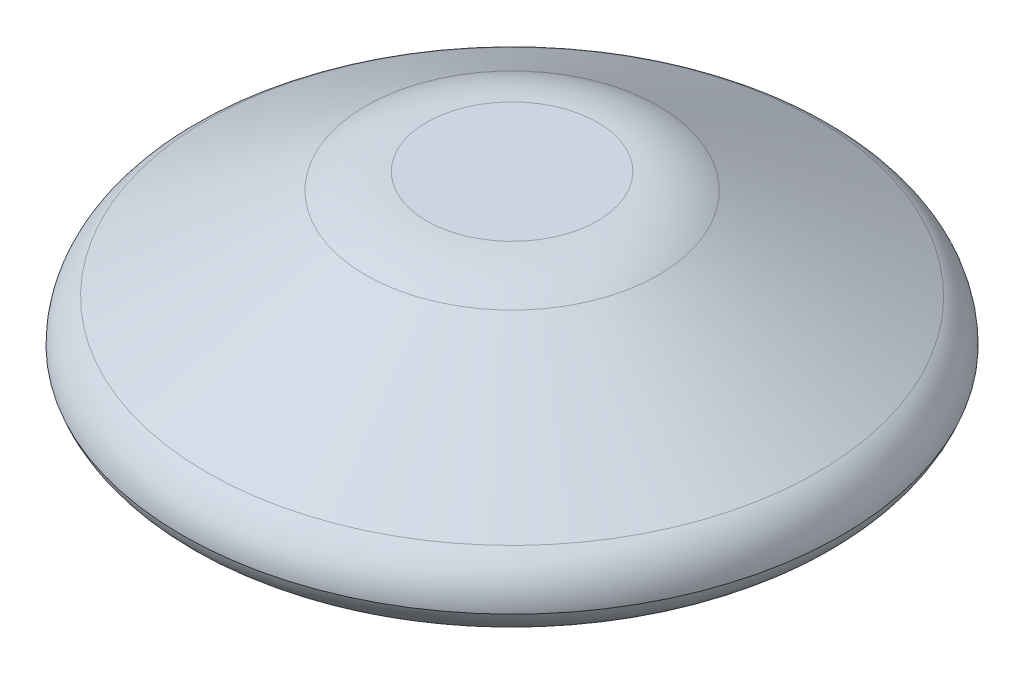
ISO-10303-21;
HEADER;
FILE_DESCRIPTION(('STEP AP214'),'2;1');
FILE_NAME('part.step','',(''),(''),'','','');
FILE_SCHEMA(('AUTOMOTIVE_DESIGN { 1 0 10303 214 1 1 1 1 }'));
ENDSEC;
DATA;
#1=APPLICATION_CONTEXT('core data for automotive mechanical design processes');
#2=APPLICATION_PROTOCOL_DEFINITION('international standard','automotive_design',2000,#1);
#3=PRODUCT_CONTEXT('',#1,'mechanical');
#4=PRODUCT('Part','Part','',(#3));
#5=PRODUCT_RELATED_PRODUCT_CATEGORY('part','',(#4));
#6=PRODUCT_DEFINITION_FORMATION('','',#4);
#7=PRODUCT_DEFINITION_CONTEXT('part definition',#1,'design');
#8=PRODUCT_DEFINITION('design','',#6,#7);
#9=PRODUCT_DEFINITION_SHAPE('','',#8);
#10=(LENGTH_UNIT() NAMED_UNIT(*) SI_UNIT(.MILLI.,.METRE.));
#11=(NAMED_UNIT(*) PLANE_ANGLE_UNIT() SI_UNIT($,.RADIAN.));
#12=(NAMED_UNIT(*) SI_UNIT($,.STERADIAN.) SOLID_ANGLE_UNIT());
#13=UNCERTAINTY_MEASURE_WITH_UNIT(LENGTH_MEASURE(1.E-05),#10,'distance_accuracy_value','');
#14=(GEOMETRIC_REPRESENTATION_CONTEXT(3) GLOBAL_UNCERTAINTY_ASSIGNED_CONTEXT((#13)) GLOBAL_UNIT_ASSIGNED_CONTEXT((#10,
#11,#12)) REPRESENTATION_CONTEXT('',''));
#15=CARTESIAN_POINT('',(0.,0.,0.));
#16=DIRECTION('',(0.,0.,1.));
#17=DIRECTION('',(1.,0.,0.));
#18=AXIS2_PLACEMENT_3D('',#15,#16,#17);
#19=CARTESIAN_POINT('',(0.,15.,0.));
#20=DIRECTION('',(0.,1.,0.));
#21=DIRECTION('',(0.,0.,1.));
#22=AXIS2_PLACEMENT_3D('',#19,#20,#21);
#23=PLANE('',#22);
#24=CARTESIAN_POINT('',(0.,15.,0.));
#25=DIRECTION('',(0.,1.,0.));
#26=DIRECTION('',(0.,0.,1.));
#27=AXIS2_PLACEMENT_3D('',#24,#25,#26);
#28=CIRCLE('',#27,7.00000000000001);
#29=CARTESIAN_POINT('',(0.,15.,7.00000000000001));
#30=VERTEX_POINT('',#29);
#31=EDGE_CURVE('E50',#30,#30,#28,.T.);
#32=ORIENTED_EDGE('',*,*,#31,.T.);
#33=EDGE_LOOP('',(#32));
#34=FACE_BOUND('',#33,.T.);
#35=ADVANCED_FACE('F30',(#34),#23,.T.);
#36=CARTESIAN_POINT('',(0.,0.,0.));
#37=DIRECTION('',(0.,1.,0.));
#38=DIRECTION('',(0.,0.,1.));
#39=AXIS2_PLACEMENT_3D('',#36,#37,#38);
#40=PLANE('',#39);
#41=CARTESIAN_POINT('',(0.,0.,0.));
#42=DIRECTION('',(0.,-1.,0.));
#43=DIRECTION('',(0.,0.,-1.));
#44=AXIS2_PLACEMENT_3D('',#41,#42,#43);
#45=CIRCLE('',#44,10.);
#46=CARTESIAN_POINT('',(0.,0.,-10.));
#47=VERTEX_POINT('',#46);
#48=EDGE_CURVE('E54',#47,#47,#45,.T.);
#49=ORIENTED_EDGE('',*,*,#48,.F.);
#50=EDGE_LOOP('',(#49));
#51=FACE_BOUND('',#50,.T.);
#52=CARTESIAN_POINT('',(0.,0.,0.));
#53=DIRECTION('',(0.,1.,0.));
#54=DIRECTION('',(0.,0.,1.));
#55=AXIS2_PLACEMENT_3D('',#52,#53,#54);
#56=CIRCLE('',#55,23.2203877420847);
#57=CARTESIAN_POINT('',(0.,0.,23.2203877420847));
#58=VERTEX_POINT('',#57);
#59=EDGE_CURVE('E10',#58,#58,#56,.F.);
#60=ORIENTED_EDGE('',*,*,#59,.T.);
#61=EDGE_LOOP('',(#60));
#62=FACE_BOUND('',#61,.T.);
#63=ADVANCED_FACE('F68',(#51,#62),#40,.F.);
#64=CARTESIAN_POINT('',(0.,15.,0.));
#65=DIRECTION('',(0.,-1.,0.));
#66=DIRECTION('',(0.,0.,-1.));
#67=AXIS2_PLACEMENT_3D('',#64,#65,#66);
#68=CONICAL_SURFACE('',#67,9.67949192431124,1.0471975511966);
#69=CARTESIAN_POINT('',(0.,6.15470053837923,0.));
#70=DIRECTION('',(0.,-1.,0.));
#71=DIRECTION('',(0.,0.,-1.));
#72=AXIS2_PLACEMENT_3D('',#69,#70,#71);
#73=CIRCLE('',#72,25.);
#74=CARTESIAN_POINT('',(0.,6.15470053837923,-25.));
#75=VERTEX_POINT('',#74);
#76=EDGE_CURVE('E37',#75,#75,#73,.F.);
#77=ORIENTED_EDGE('',*,*,#76,.T.);
#78=EDGE_LOOP('',(#77));
#79=FACE_BOUND('',#78,.T.);
#80=CARTESIAN_POINT('',(0.,13.6602540378444,0.));
#81=DIRECTION('',(0.,1.,0.));
#82=DIRECTION('',(0.,0.,1.));
#83=AXIS2_PLACEMENT_3D('',#80,#81,#82);
#84=CIRCLE('',#83,12.);
#85=CARTESIAN_POINT('',(0.,13.6602540378444,12.));
#86=VERTEX_POINT('',#85);
#87=EDGE_CURVE('E45',#86,#86,#84,.F.);
#88=ORIENTED_EDGE('',*,*,#87,.T.);
#89=EDGE_LOOP('',(#88));
#90=FACE_BOUND('',#89,.T.);
#91=ADVANCED_FACE('F70',(#79,#90),#68,.T.);
#92=CARTESIAN_POINT('',(0.,5.,0.));
#93=DIRECTION('',(0.,1.,0.));
#94=DIRECTION('',(0.,0.,1.));
#95=AXIS2_PLACEMENT_3D('',#92,#93,#94);
#96=DEGENERATE_TOROIDAL_SURFACE('',#95,7.00000000000001,10.,.T.);
#97=ORIENTED_EDGE('',*,*,#87,.F.);
#98=EDGE_LOOP('',(#97));
#99=FACE_BOUND('',#98,.T.);
#100=ORIENTED_EDGE('',*,*,#31,.F.);
#101=EDGE_LOOP('',(#100));
#102=FACE_BOUND('',#101,.T.);
#103=ADVANCED_FACE('F76',(#99,#102),#96,.T.);
#104=CARTESIAN_POINT('',(0.,2.69059892324148,0.));
#105=DIRECTION('',(0.,1.,0.));
#106=DIRECTION('',(0.,0.,1.));
#107=AXIS2_PLACEMENT_3D('',#104,#105,#106);
#108=TOROIDAL_SURFACE('',#107,23.,4.);
#109=ORIENTED_EDGE('',*,*,#76,.F.);
#110=EDGE_LOOP('',(#109));
#111=FACE_BOUND('',#110,.T.);
#112=CARTESIAN_POINT('',(0.,2.69059892324148,0.));
#113=DIRECTION('',(0.,1.,0.));
#114=DIRECTION('',(0.,0.,1.));
#115=AXIS2_PLACEMENT_3D('',#112,#113,#114);
#116=CIRCLE('',#115,27.);
#117=CARTESIAN_POINT('',(0.,2.69059892324148,27.));
#118=VERTEX_POINT('',#117);
#119=EDGE_CURVE('E41',#118,#118,#116,.F.);
#120=ORIENTED_EDGE('',*,*,#119,.F.);
#121=EDGE_LOOP('',(#120));
#122=FACE_BOUND('',#121,.T.);
#123=ADVANCED_FACE('F82',(#111,#122),#108,.T.);
#124=CARTESIAN_POINT('',(0.,4.,0.));
#125=DIRECTION('',(0.,-1.,0.));
#126=DIRECTION('',(0.,0.,-1.));
#127=AXIS2_PLACEMENT_3D('',#124,#125,#126);
#128=TOROIDAL_SURFACE('',#127,23.2203877420847,4.);
#129=ORIENTED_EDGE('',*,*,#59,.F.);
#130=EDGE_LOOP('',(#129));
#131=FACE_BOUND('',#130,.T.);
#132=ORIENTED_EDGE('',*,*,#119,.T.);
#133=EDGE_LOOP('',(#132));
#134=FACE_BOUND('',#133,.T.);
#135=ADVANCED_FACE('F32',(#131,#134),#128,.T.);
#136=CARTESIAN_POINT('',(0.,2.,0.));
#137=DIRECTION('',(0.,-1.,0.));
#138=DIRECTION('',(0.,0.,-1.));
#139=AXIS2_PLACEMENT_3D('',#136,#137,#138);
#140=CYLINDRICAL_SURFACE('',#139,10.);
#141=CARTESIAN_POINT('',(0.,2.,0.));
#142=DIRECTION('',(0.,-1.,0.));
#143=DIRECTION('',(0.,0.,-1.));
#144=AXIS2_PLACEMENT_3D('',#141,#142,#143);
#145=CIRCLE('',#144,10.);
#146=CARTESIAN_POINT('',(0.,2.,-10.));
#147=VERTEX_POINT('',#146);
#148=EDGE_CURVE('E53',#147,#147,#145,.T.);
#149=ORIENTED_EDGE('',*,*,#148,.F.);
#150=EDGE_LOOP('',(#149));
#151=FACE_BOUND('',#150,.T.);
#152=ORIENTED_EDGE('',*,*,#48,.T.);
#153=EDGE_LOOP('',(#152));
#154=FACE_BOUND('',#153,.T.);
#155=ADVANCED_FACE('F62',(#151,#154),#140,.F.);
#156=CARTESIAN_POINT('',(0.,2.,0.));
#157=DIRECTION('',(0.,-1.,0.));
#158=DIRECTION('',(0.,0.,-1.));
#159=AXIS2_PLACEMENT_3D('',#156,#157,#158);
#160=PLANE('',#159);
#161=ORIENTED_EDGE('',*,*,#148,.T.);
#162=EDGE_LOOP('',(#161));
#163=FACE_BOUND('',#162,.T.);
#164=ADVANCED_FACE('F60',(#163),#160,.T.);
#165=CLOSED_SHELL('',(#35,#63,#91,#103,#123,#135,#155,#164));
#166=MANIFOLD_SOLID_BREP('B2',#165);
#167=ADVANCED_BREP_SHAPE_REPRESENTATION('',(#18,#166),#14);
#168=SHAPE_DEFINITION_REPRESENTATION(#9,#167);
ENDSEC;
END-ISO-10303-21;
